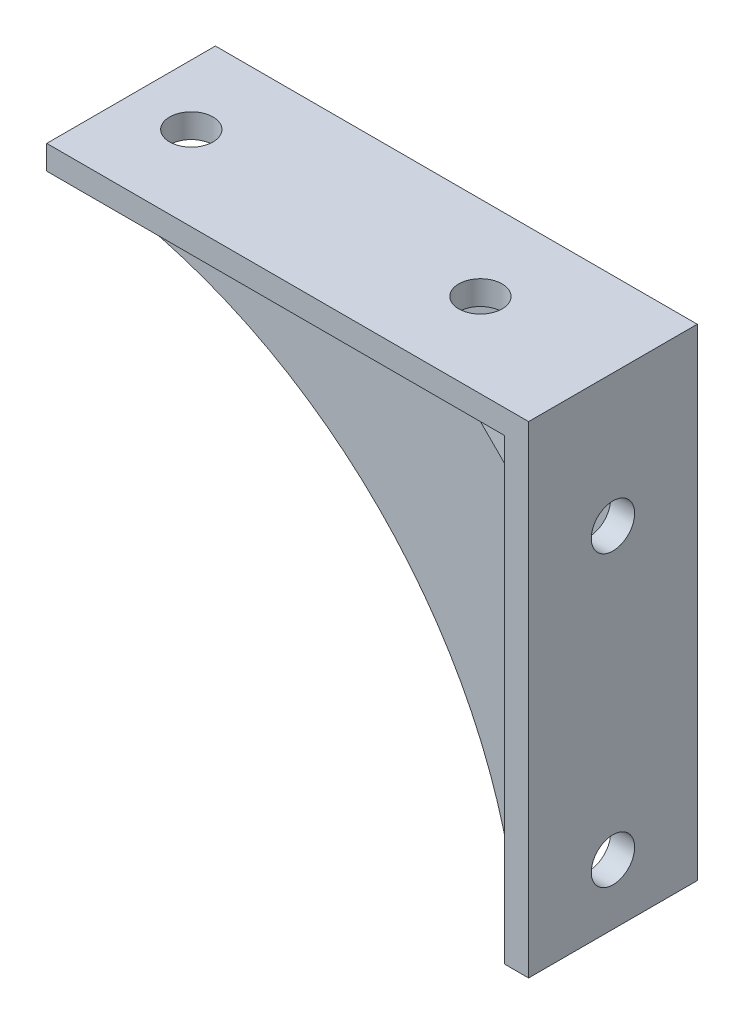
ISO-10303-21;
HEADER;
FILE_DESCRIPTION(('STEP AP214'),'2;1');
FILE_NAME('part.step','',(''),(''),'','','');
FILE_SCHEMA(('AUTOMOTIVE_DESIGN { 1 0 10303 214 1 1 1 1 }'));
ENDSEC;
DATA;
#1=APPLICATION_CONTEXT('core data for automotive mechanical design processes');
#2=APPLICATION_PROTOCOL_DEFINITION('international standard','automotive_design',2000,#1);
#3=PRODUCT_CONTEXT('',#1,'mechanical');
#4=PRODUCT('Part','Part','',(#3));
#5=PRODUCT_RELATED_PRODUCT_CATEGORY('part','',(#4));
#6=PRODUCT_DEFINITION_FORMATION('','',#4);
#7=PRODUCT_DEFINITION_CONTEXT('part definition',#1,'design');
#8=PRODUCT_DEFINITION('design','',#6,#7);
#9=PRODUCT_DEFINITION_SHAPE('','',#8);
#10=(LENGTH_UNIT() NAMED_UNIT(*) SI_UNIT(.MILLI.,.METRE.));
#11=(NAMED_UNIT(*) PLANE_ANGLE_UNIT() SI_UNIT($,.RADIAN.));
#12=(NAMED_UNIT(*) SI_UNIT($,.STERADIAN.) SOLID_ANGLE_UNIT());
#13=UNCERTAINTY_MEASURE_WITH_UNIT(LENGTH_MEASURE(1.E-05),#10,'distance_accuracy_value','');
#14=(GEOMETRIC_REPRESENTATION_CONTEXT(3) GLOBAL_UNCERTAINTY_ASSIGNED_CONTEXT((#13)) GLOBAL_UNIT_ASSIGNED_CONTEXT((#10,
#11,#12)) REPRESENTATION_CONTEXT('',''));
#15=CARTESIAN_POINT('',(0.,0.,0.));
#16=DIRECTION('',(0.,0.,1.));
#17=DIRECTION('',(1.,0.,0.));
#18=AXIS2_PLACEMENT_3D('',#15,#16,#17);
#19=CARTESIAN_POINT('',(-10.,0.,35.));
#20=DIRECTION('',(1.,0.,0.));
#21=DIRECTION('',(0.,1.,0.));
#22=AXIS2_PLACEMENT_3D('',#19,#20,#21);
#23=PLANE('',#22);
#24=CARTESIAN_POINT('',(-9.99999999999999,-55.,0.));
#25=DIRECTION('',(-1.,0.,0.));
#26=DIRECTION('',(0.,-1.,0.));
#27=AXIS2_PLACEMENT_3D('',#24,#25,#26);
#28=CIRCLE('',#27,9.);
#29=CARTESIAN_POINT('',(-9.99999999999999,-64.,0.));
#30=VERTEX_POINT('',#29);
#31=EDGE_CURVE('E161',#30,#30,#28,.T.);
#32=ORIENTED_EDGE('',*,*,#31,.F.);
#33=EDGE_LOOP('',(#32));
#34=FACE_BOUND('',#33,.T.);
#35=CARTESIAN_POINT('',(-9.99999999999998,-175.,0.));
#36=DIRECTION('',(-1.,0.,0.));
#37=DIRECTION('',(0.,-1.,0.));
#38=AXIS2_PLACEMENT_3D('',#35,#36,#37);
#39=CIRCLE('',#38,9.);
#40=CARTESIAN_POINT('',(-9.99999999999998,-184.,0.));
#41=VERTEX_POINT('',#40);
#42=EDGE_CURVE('E260',#41,#41,#39,.T.);
#43=ORIENTED_EDGE('',*,*,#42,.F.);
#44=EDGE_LOOP('',(#43));
#45=FACE_BOUND('',#44,.T.);
#46=DIRECTION('',(0.,0.,1.));
#47=VECTOR('',#46,1.);
#48=CARTESIAN_POINT('',(-10.,-185.,20.));
#49=LINE('',#48,#47);
#50=CARTESIAN_POINT('',(-9.99999999999998,-185.,20.));
#51=VERTEX_POINT('',#50);
#52=CARTESIAN_POINT('',(-9.99999999999998,-185.,30.));
#53=VERTEX_POINT('',#52);
#54=EDGE_CURVE('E56',#51,#53,#49,.T.);
#55=ORIENTED_EDGE('',*,*,#54,.F.);
#56=DIRECTION('',(0.,-1.,0.));
#57=VECTOR('',#56,1.);
#58=CARTESIAN_POINT('',(-10.,-30.,20.));
#59=LINE('',#58,#57);
#60=CARTESIAN_POINT('',(-10.,-30.,20.));
#61=VERTEX_POINT('',#60);
#62=EDGE_CURVE('E51',#61,#51,#59,.T.);
#63=ORIENTED_EDGE('',*,*,#62,.F.);
#64=DIRECTION('',(0.,0.,1.));
#65=VECTOR('',#64,1.);
#66=CARTESIAN_POINT('',(-10.,-30.,20.));
#67=LINE('',#66,#65);
#68=CARTESIAN_POINT('',(-10.,-30.,30.));
#69=VERTEX_POINT('',#68);
#70=EDGE_CURVE('E171',#61,#69,#67,.T.);
#71=ORIENTED_EDGE('',*,*,#70,.T.);
#72=DIRECTION('',(0.,-1.,0.));
#73=VECTOR('',#72,1.);
#74=CARTESIAN_POINT('',(-10.,-30.,30.));
#75=LINE('',#74,#73);
#76=EDGE_CURVE('E152',#69,#53,#75,.T.);
#77=ORIENTED_EDGE('',*,*,#76,.T.);
#78=EDGE_LOOP('',(#55,#63,#71,#77));
#79=FACE_BOUND('',#78,.T.);
#80=DIRECTION('',(0.,0.,-1.));
#81=VECTOR('',#80,1.);
#82=CARTESIAN_POINT('',(-10.,-30.,-20.));
#83=LINE('',#82,#81);
#84=CARTESIAN_POINT('',(-10.,-30.,-20.));
#85=VERTEX_POINT('',#84);
#86=CARTESIAN_POINT('',(-9.99999999999999,-30.,-30.));
#87=VERTEX_POINT('',#86);
#88=EDGE_CURVE('E202',#85,#87,#83,.T.);
#89=ORIENTED_EDGE('',*,*,#88,.F.);
#90=DIRECTION('',(0.,-1.,0.));
#91=VECTOR('',#90,1.);
#92=CARTESIAN_POINT('',(-10.,-30.,-20.));
#93=LINE('',#92,#91);
#94=CARTESIAN_POINT('',(-9.99999999999998,-185.,-20.));
#95=VERTEX_POINT('',#94);
#96=EDGE_CURVE('E180',#85,#95,#93,.T.);
#97=ORIENTED_EDGE('',*,*,#96,.T.);
#98=DIRECTION('',(0.,0.,-1.));
#99=VECTOR('',#98,1.);
#100=CARTESIAN_POINT('',(-10.,-185.,-20.));
#101=LINE('',#100,#99);
#102=CARTESIAN_POINT('',(-10.,-185.,-30.));
#103=VERTEX_POINT('',#102);
#104=EDGE_CURVE('E200',#95,#103,#101,.T.);
#105=ORIENTED_EDGE('',*,*,#104,.T.);
#106=DIRECTION('',(0.,-1.,0.));
#107=VECTOR('',#106,1.);
#108=CARTESIAN_POINT('',(-10.,-30.,-30.));
#109=LINE('',#108,#107);
#110=EDGE_CURVE('E191',#87,#103,#109,.T.);
#111=ORIENTED_EDGE('',*,*,#110,.F.);
#112=EDGE_LOOP('',(#89,#97,#105,#111));
#113=FACE_BOUND('',#112,.T.);
#114=DIRECTION('',(0.,-1.,0.));
#115=VECTOR('',#114,1.);
#116=CARTESIAN_POINT('',(-10.,0.,-35.));
#117=LINE('',#116,#115);
#118=CARTESIAN_POINT('',(-10.,-10.,-35.));
#119=VERTEX_POINT('',#118);
#120=CARTESIAN_POINT('',(-9.99999999999998,-200.,-35.));
#121=VERTEX_POINT('',#120);
#122=EDGE_CURVE('E199',#119,#121,#117,.T.);
#123=ORIENTED_EDGE('',*,*,#122,.T.);
#124=DIRECTION('',(0.,0.,-1.));
#125=VECTOR('',#124,1.);
#126=CARTESIAN_POINT('',(-9.99999999999998,-200.,35.));
#127=LINE('',#126,#125);
#128=CARTESIAN_POINT('',(-9.99999999999998,-200.,35.));
#129=VERTEX_POINT('',#128);
#130=EDGE_CURVE('E11',#129,#121,#127,.T.);
#131=ORIENTED_EDGE('',*,*,#130,.F.);
#132=DIRECTION('',(0.,-1.,0.));
#133=VECTOR('',#132,1.);
#134=CARTESIAN_POINT('',(-10.,0.,35.));
#135=LINE('',#134,#133);
#136=CARTESIAN_POINT('',(-10.,-10.,35.));
#137=VERTEX_POINT('',#136);
#138=EDGE_CURVE('E206',#137,#129,#135,.T.);
#139=ORIENTED_EDGE('',*,*,#138,.F.);
#140=DIRECTION('',(0.,0.,-1.));
#141=VECTOR('',#140,1.);
#142=CARTESIAN_POINT('',(-10.,-10.,35.));
#143=LINE('',#142,#141);
#144=EDGE_CURVE('E223',#137,#119,#143,.T.);
#145=ORIENTED_EDGE('',*,*,#144,.T.);
#146=EDGE_LOOP('',(#123,#131,#139,#145));
#147=FACE_BOUND('',#146,.T.);
#148=ADVANCED_FACE('F35',(#34,#45,#79,#113,#147),#23,.F.);
#149=CARTESIAN_POINT('',(0.,-200.,35.));
#150=DIRECTION('',(0.,-1.,0.));
#151=DIRECTION('',(0.,0.,-1.));
#152=AXIS2_PLACEMENT_3D('',#149,#150,#151);
#153=PLANE('',#152);
#154=DIRECTION('',(-1.,0.,0.));
#155=VECTOR('',#154,1.);
#156=CARTESIAN_POINT('',(0.,-200.,-35.));
#157=LINE('',#156,#155);
#158=CARTESIAN_POINT('',(0.,-200.,-35.));
#159=VERTEX_POINT('',#158);
#160=EDGE_CURVE('E226',#159,#121,#157,.T.);
#161=ORIENTED_EDGE('',*,*,#160,.F.);
#162=DIRECTION('',(0.,0.,-1.));
#163=VECTOR('',#162,1.);
#164=CARTESIAN_POINT('',(0.,-200.,35.));
#165=LINE('',#164,#163);
#166=CARTESIAN_POINT('',(0.,-200.,35.));
#167=VERTEX_POINT('',#166);
#168=EDGE_CURVE('E43',#167,#159,#165,.T.);
#169=ORIENTED_EDGE('',*,*,#168,.F.);
#170=DIRECTION('',(-1.,0.,0.));
#171=VECTOR('',#170,1.);
#172=CARTESIAN_POINT('',(0.,-200.,35.));
#173=LINE('',#172,#171);
#174=EDGE_CURVE('E208',#167,#129,#173,.T.);
#175=ORIENTED_EDGE('',*,*,#174,.T.);
#176=ORIENTED_EDGE('',*,*,#130,.T.);
#177=EDGE_LOOP('',(#161,#169,#175,#176));
#178=FACE_BOUND('',#177,.T.);
#179=ADVANCED_FACE('F279',(#178),#153,.T.);
#180=CARTESIAN_POINT('',(0.,0.,35.));
#181=DIRECTION('',(1.,0.,0.));
#182=DIRECTION('',(0.,1.,0.));
#183=AXIS2_PLACEMENT_3D('',#180,#181,#182);
#184=PLANE('',#183);
#185=CARTESIAN_POINT('',(0.,-55.,0.));
#186=DIRECTION('',(-1.,0.,0.));
#187=DIRECTION('',(0.,-1.,0.));
#188=AXIS2_PLACEMENT_3D('',#185,#186,#187);
#189=CIRCLE('',#188,9.);
#190=CARTESIAN_POINT('',(0.,-64.,0.));
#191=VERTEX_POINT('',#190);
#192=EDGE_CURVE('E158',#191,#191,#189,.T.);
#193=ORIENTED_EDGE('',*,*,#192,.T.);
#194=EDGE_LOOP('',(#193));
#195=FACE_BOUND('',#194,.T.);
#196=CARTESIAN_POINT('',(0.,-175.,0.));
#197=DIRECTION('',(-1.,0.,0.));
#198=DIRECTION('',(0.,-1.,0.));
#199=AXIS2_PLACEMENT_3D('',#196,#197,#198);
#200=CIRCLE('',#199,9.);
#201=CARTESIAN_POINT('',(0.,-184.,0.));
#202=VERTEX_POINT('',#201);
#203=EDGE_CURVE('E264',#202,#202,#200,.T.);
#204=ORIENTED_EDGE('',*,*,#203,.T.);
#205=EDGE_LOOP('',(#204));
#206=FACE_BOUND('',#205,.T.);
#207=DIRECTION('',(0.,-1.,0.));
#208=VECTOR('',#207,1.);
#209=CARTESIAN_POINT('',(0.,0.,-35.));
#210=LINE('',#209,#208);
#211=CARTESIAN_POINT('',(0.,0.,-35.));
#212=VERTEX_POINT('',#211);
#213=EDGE_CURVE('E229',#212,#159,#210,.T.);
#214=ORIENTED_EDGE('',*,*,#213,.F.);
#215=DIRECTION('',(0.,0.,-1.));
#216=VECTOR('',#215,1.);
#217=CARTESIAN_POINT('',(0.,0.,35.));
#218=LINE('',#217,#216);
#219=CARTESIAN_POINT('',(0.,0.,35.));
#220=VERTEX_POINT('',#219);
#221=EDGE_CURVE('E245',#220,#212,#218,.T.);
#222=ORIENTED_EDGE('',*,*,#221,.F.);
#223=DIRECTION('',(0.,-1.,0.));
#224=VECTOR('',#223,1.);
#225=CARTESIAN_POINT('',(0.,0.,35.));
#226=LINE('',#225,#224);
#227=EDGE_CURVE('E212',#220,#167,#226,.T.);
#228=ORIENTED_EDGE('',*,*,#227,.T.);
#229=ORIENTED_EDGE('',*,*,#168,.T.);
#230=EDGE_LOOP('',(#214,#222,#228,#229));
#231=FACE_BOUND('',#230,.T.);
#232=ADVANCED_FACE('F299',(#195,#206,#231),#184,.T.);
#233=CARTESIAN_POINT('',(-200.,0.,35.));
#234=DIRECTION('',(0.,1.,0.));
#235=DIRECTION('',(0.,0.,1.));
#236=AXIS2_PLACEMENT_3D('',#233,#234,#235);
#237=PLANE('',#236);
#238=CARTESIAN_POINT('',(-175.,0.,0.));
#239=DIRECTION('',(0.,1.,0.));
#240=DIRECTION('',(0.,0.,1.));
#241=AXIS2_PLACEMENT_3D('',#238,#239,#240);
#242=CIRCLE('',#241,9.);
#243=CARTESIAN_POINT('',(-175.,0.,9.));
#244=VERTEX_POINT('',#243);
#245=EDGE_CURVE('E257',#244,#244,#242,.T.);
#246=ORIENTED_EDGE('',*,*,#245,.F.);
#247=EDGE_LOOP('',(#246));
#248=FACE_BOUND('',#247,.T.);
#249=CARTESIAN_POINT('',(-55.,0.,0.));
#250=DIRECTION('',(0.,1.,0.));
#251=DIRECTION('',(0.,0.,1.));
#252=AXIS2_PLACEMENT_3D('',#249,#250,#251);
#253=CIRCLE('',#252,9.);
#254=CARTESIAN_POINT('',(-55.,0.,9.));
#255=VERTEX_POINT('',#254);
#256=EDGE_CURVE('E249',#255,#255,#253,.T.);
#257=ORIENTED_EDGE('',*,*,#256,.F.);
#258=EDGE_LOOP('',(#257));
#259=FACE_BOUND('',#258,.T.);
#260=DIRECTION('',(1.,0.,0.));
#261=VECTOR('',#260,1.);
#262=CARTESIAN_POINT('',(-200.,0.,-35.));
#263=LINE('',#262,#261);
#264=CARTESIAN_POINT('',(-200.,0.,-35.));
#265=VERTEX_POINT('',#264);
#266=EDGE_CURVE('E232',#265,#212,#263,.T.);
#267=ORIENTED_EDGE('',*,*,#266,.F.);
#268=DIRECTION('',(0.,0.,-1.));
#269=VECTOR('',#268,1.);
#270=CARTESIAN_POINT('',(-200.,0.,35.));
#271=LINE('',#270,#269);
#272=CARTESIAN_POINT('',(-200.,0.,35.));
#273=VERTEX_POINT('',#272);
#274=EDGE_CURVE('E243',#273,#265,#271,.T.);
#275=ORIENTED_EDGE('',*,*,#274,.F.);
#276=DIRECTION('',(1.,0.,0.));
#277=VECTOR('',#276,1.);
#278=CARTESIAN_POINT('',(-200.,0.,35.));
#279=LINE('',#278,#277);
#280=EDGE_CURVE('E215',#273,#220,#279,.T.);
#281=ORIENTED_EDGE('',*,*,#280,.T.);
#282=ORIENTED_EDGE('',*,*,#221,.T.);
#283=EDGE_LOOP('',(#267,#275,#281,#282));
#284=FACE_BOUND('',#283,.T.);
#285=ADVANCED_FACE('F302',(#248,#259,#284),#237,.T.);
#286=CARTESIAN_POINT('',(-200.,-10.,35.));
#287=DIRECTION('',(-1.,0.,0.));
#288=DIRECTION('',(0.,0.,1.));
#289=AXIS2_PLACEMENT_3D('',#286,#287,#288);
#290=PLANE('',#289);
#291=DIRECTION('',(0.,1.,0.));
#292=VECTOR('',#291,1.);
#293=CARTESIAN_POINT('',(-200.,-10.,-35.));
#294=LINE('',#293,#292);
#295=CARTESIAN_POINT('',(-200.,-10.,-35.));
#296=VERTEX_POINT('',#295);
#297=EDGE_CURVE('E235',#296,#265,#294,.T.);
#298=ORIENTED_EDGE('',*,*,#297,.F.);
#299=DIRECTION('',(0.,0.,-1.));
#300=VECTOR('',#299,1.);
#301=CARTESIAN_POINT('',(-200.,-10.,35.));
#302=LINE('',#301,#300);
#303=CARTESIAN_POINT('',(-200.,-10.,35.));
#304=VERTEX_POINT('',#303);
#305=EDGE_CURVE('E241',#304,#296,#302,.T.);
#306=ORIENTED_EDGE('',*,*,#305,.F.);
#307=DIRECTION('',(0.,1.,0.));
#308=VECTOR('',#307,1.);
#309=CARTESIAN_POINT('',(-200.,-10.,35.));
#310=LINE('',#309,#308);
#311=EDGE_CURVE('E218',#304,#273,#310,.T.);
#312=ORIENTED_EDGE('',*,*,#311,.T.);
#313=ORIENTED_EDGE('',*,*,#274,.T.);
#314=EDGE_LOOP('',(#298,#306,#312,#313));
#315=FACE_BOUND('',#314,.T.);
#316=ADVANCED_FACE('F306',(#315),#290,.T.);
#317=CARTESIAN_POINT('',(-200.,-10.,35.));
#318=DIRECTION('',(0.,1.,0.));
#319=DIRECTION('',(0.,0.,1.));
#320=AXIS2_PLACEMENT_3D('',#317,#318,#319);
#321=PLANE('',#320);
#322=CARTESIAN_POINT('',(-175.,-10.,0.));
#323=DIRECTION('',(0.,1.,0.));
#324=DIRECTION('',(0.,0.,1.));
#325=AXIS2_PLACEMENT_3D('',#322,#323,#324);
#326=CIRCLE('',#325,9.);
#327=CARTESIAN_POINT('',(-175.,-10.,9.));
#328=VERTEX_POINT('',#327);
#329=EDGE_CURVE('E38',#328,#328,#326,.T.);
#330=ORIENTED_EDGE('',*,*,#329,.T.);
#331=EDGE_LOOP('',(#330));
#332=FACE_BOUND('',#331,.T.);
#333=CARTESIAN_POINT('',(-55.0000000000001,-10.,0.));
#334=DIRECTION('',(0.,1.,0.));
#335=DIRECTION('',(0.,0.,1.));
#336=AXIS2_PLACEMENT_3D('',#333,#334,#335);
#337=CIRCLE('',#336,9.);
#338=CARTESIAN_POINT('',(-55.0000000000001,-10.,9.));
#339=VERTEX_POINT('',#338);
#340=EDGE_CURVE('E247',#339,#339,#337,.T.);
#341=ORIENTED_EDGE('',*,*,#340,.T.);
#342=EDGE_LOOP('',(#341));
#343=FACE_BOUND('',#342,.T.);
#344=DIRECTION('',(0.,0.,1.));
#345=VECTOR('',#344,1.);
#346=CARTESIAN_POINT('',(-30.,-10.,20.));
#347=LINE('',#346,#345);
#348=CARTESIAN_POINT('',(-30.,-10.,20.));
#349=VERTEX_POINT('',#348);
#350=CARTESIAN_POINT('',(-30.,-10.,30.));
#351=VERTEX_POINT('',#350);
#352=EDGE_CURVE('E168',#349,#351,#347,.T.);
#353=ORIENTED_EDGE('',*,*,#352,.F.);
#354=DIRECTION('',(1.,0.,0.));
#355=VECTOR('',#354,1.);
#356=CARTESIAN_POINT('',(-185.,-10.,20.));
#357=LINE('',#356,#355);
#358=CARTESIAN_POINT('',(-185.,-10.,20.));
#359=VERTEX_POINT('',#358);
#360=EDGE_CURVE('E141',#359,#349,#357,.T.);
#361=ORIENTED_EDGE('',*,*,#360,.F.);
#362=DIRECTION('',(0.,0.,1.));
#363=VECTOR('',#362,1.);
#364=CARTESIAN_POINT('',(-185.,-10.,20.));
#365=LINE('',#364,#363);
#366=CARTESIAN_POINT('',(-185.,-10.,30.));
#367=VERTEX_POINT('',#366);
#368=EDGE_CURVE('E133',#359,#367,#365,.T.);
#369=ORIENTED_EDGE('',*,*,#368,.T.);
#370=DIRECTION('',(1.,0.,0.));
#371=VECTOR('',#370,1.);
#372=CARTESIAN_POINT('',(-185.,-10.,30.));
#373=LINE('',#372,#371);
#374=EDGE_CURVE('E138',#367,#351,#373,.T.);
#375=ORIENTED_EDGE('',*,*,#374,.T.);
#376=EDGE_LOOP('',(#353,#361,#369,#375));
#377=FACE_BOUND('',#376,.T.);
#378=DIRECTION('',(0.,0.,-1.));
#379=VECTOR('',#378,1.);
#380=CARTESIAN_POINT('',(-185.,-10.,-20.));
#381=LINE('',#380,#379);
#382=CARTESIAN_POINT('',(-185.,-10.,-20.));
#383=VERTEX_POINT('',#382);
#384=CARTESIAN_POINT('',(-185.,-10.,-30.));
#385=VERTEX_POINT('',#384);
#386=EDGE_CURVE('E196',#383,#385,#381,.T.);
#387=ORIENTED_EDGE('',*,*,#386,.F.);
#388=DIRECTION('',(1.,0.,0.));
#389=VECTOR('',#388,1.);
#390=CARTESIAN_POINT('',(-185.,-10.,-20.));
#391=LINE('',#390,#389);
#392=CARTESIAN_POINT('',(-30.,-10.,-20.));
#393=VERTEX_POINT('',#392);
#394=EDGE_CURVE('E174',#383,#393,#391,.T.);
#395=ORIENTED_EDGE('',*,*,#394,.T.);
#396=DIRECTION('',(0.,0.,-1.));
#397=VECTOR('',#396,1.);
#398=CARTESIAN_POINT('',(-30.,-10.,-20.));
#399=LINE('',#398,#397);
#400=CARTESIAN_POINT('',(-30.,-10.,-30.));
#401=VERTEX_POINT('',#400);
#402=EDGE_CURVE('E185',#393,#401,#399,.T.);
#403=ORIENTED_EDGE('',*,*,#402,.T.);
#404=DIRECTION('',(1.,0.,0.));
#405=VECTOR('',#404,1.);
#406=CARTESIAN_POINT('',(-185.,-10.,-30.));
#407=LINE('',#406,#405);
#408=EDGE_CURVE('E170',#385,#401,#407,.T.);
#409=ORIENTED_EDGE('',*,*,#408,.F.);
#410=EDGE_LOOP('',(#387,#395,#403,#409));
#411=FACE_BOUND('',#410,.T.);
#412=DIRECTION('',(1.,0.,0.));
#413=VECTOR('',#412,1.);
#414=CARTESIAN_POINT('',(-200.,-10.,-35.));
#415=LINE('',#414,#413);
#416=EDGE_CURVE('E209',#296,#119,#415,.T.);
#417=ORIENTED_EDGE('',*,*,#416,.T.);
#418=ORIENTED_EDGE('',*,*,#144,.F.);
#419=DIRECTION('',(1.,0.,0.));
#420=VECTOR('',#419,1.);
#421=CARTESIAN_POINT('',(-200.,-10.,35.));
#422=LINE('',#421,#420);
#423=EDGE_CURVE('E221',#304,#137,#422,.T.);
#424=ORIENTED_EDGE('',*,*,#423,.F.);
#425=ORIENTED_EDGE('',*,*,#305,.T.);
#426=EDGE_LOOP('',(#417,#418,#424,#425));
#427=FACE_BOUND('',#426,.T.);
#428=ADVANCED_FACE('F135',(#332,#343,#377,#411,#427),#321,.F.);
#429=CARTESIAN_POINT('',(0.,0.,35.));
#430=DIRECTION('',(0.,0.,-1.));
#431=DIRECTION('',(-1.,0.,0.));
#432=AXIS2_PLACEMENT_3D('',#429,#430,#431);
#433=PLANE('',#432);
#434=ORIENTED_EDGE('',*,*,#138,.T.);
#435=ORIENTED_EDGE('',*,*,#174,.F.);
#436=ORIENTED_EDGE('',*,*,#227,.F.);
#437=ORIENTED_EDGE('',*,*,#280,.F.);
#438=ORIENTED_EDGE('',*,*,#311,.F.);
#439=ORIENTED_EDGE('',*,*,#423,.T.);
#440=EDGE_LOOP('',(#434,#435,#436,#437,#438,#439));
#441=FACE_BOUND('',#440,.T.);
#442=ADVANCED_FACE('F296',(#441),#433,.F.);
#443=CARTESIAN_POINT('',(0.,0.,-35.));
#444=DIRECTION('',(0.,0.,-1.));
#445=DIRECTION('',(-1.,0.,0.));
#446=AXIS2_PLACEMENT_3D('',#443,#444,#445);
#447=PLANE('',#446);
#448=ORIENTED_EDGE('',*,*,#122,.F.);
#449=ORIENTED_EDGE('',*,*,#416,.F.);
#450=ORIENTED_EDGE('',*,*,#297,.T.);
#451=ORIENTED_EDGE('',*,*,#266,.T.);
#452=ORIENTED_EDGE('',*,*,#213,.T.);
#453=ORIENTED_EDGE('',*,*,#160,.T.);
#454=EDGE_LOOP('',(#448,#449,#450,#451,#452,#453));
#455=FACE_BOUND('',#454,.T.);
#456=ADVANCED_FACE('F290',(#455),#447,.T.);
#457=CARTESIAN_POINT('',(-208.602430216445,-208.602430216445,-20.));
#458=DIRECTION('',(0.,0.,-1.));
#459=DIRECTION('',(-1.,0.,0.));
#460=AXIS2_PLACEMENT_3D('',#457,#458,#459);
#461=CYLINDRICAL_SURFACE('',#460,200.);
#462=CARTESIAN_POINT('',(-208.602430216445,-208.602430216445,-30.));
#463=DIRECTION('',(0.,0.,1.));
#464=DIRECTION('',(1.,0.,0.));
#465=AXIS2_PLACEMENT_3D('',#462,#463,#464);
#466=CIRCLE('',#465,200.);
#467=EDGE_CURVE('E177',#103,#385,#466,.T.);
#468=ORIENTED_EDGE('',*,*,#467,.F.);
#469=ORIENTED_EDGE('',*,*,#104,.F.);
#470=CARTESIAN_POINT('',(-208.602430216445,-208.602430216445,-20.));
#471=DIRECTION('',(0.,0.,1.));
#472=DIRECTION('',(1.,0.,0.));
#473=AXIS2_PLACEMENT_3D('',#470,#471,#472);
#474=CIRCLE('',#473,200.);
#475=EDGE_CURVE('E182',#95,#383,#474,.T.);
#476=ORIENTED_EDGE('',*,*,#475,.T.);
#477=ORIENTED_EDGE('',*,*,#386,.T.);
#478=EDGE_LOOP('',(#468,#469,#476,#477));
#479=FACE_BOUND('',#478,.T.);
#480=ADVANCED_FACE('F360',(#479),#461,.F.);
#481=CARTESIAN_POINT('',(-30.,-10.,-20.));
#482=DIRECTION('',(0.707106781186548,0.707106781186547,0.));
#483=DIRECTION('',(-0.707106781186547,0.707106781186548,0.));
#484=AXIS2_PLACEMENT_3D('',#481,#482,#483);
#485=PLANE('',#484);
#486=DIRECTION('',(0.707106781186547,-0.707106781186548,0.));
#487=VECTOR('',#486,1.);
#488=CARTESIAN_POINT('',(-30.,-10.,-30.));
#489=LINE('',#488,#487);
#490=EDGE_CURVE('E188',#401,#87,#489,.T.);
#491=ORIENTED_EDGE('',*,*,#490,.F.);
#492=ORIENTED_EDGE('',*,*,#402,.F.);
#493=DIRECTION('',(0.707106781186547,-0.707106781186548,0.));
#494=VECTOR('',#493,1.);
#495=CARTESIAN_POINT('',(-30.,-10.,-20.));
#496=LINE('',#495,#494);
#497=EDGE_CURVE('E176',#393,#85,#496,.T.);
#498=ORIENTED_EDGE('',*,*,#497,.T.);
#499=ORIENTED_EDGE('',*,*,#88,.T.);
#500=EDGE_LOOP('',(#491,#492,#498,#499));
#501=FACE_BOUND('',#500,.T.);
#502=ADVANCED_FACE('F368',(#501),#485,.T.);
#503=CARTESIAN_POINT('',(-208.602430216445,-208.602430216445,-20.));
#504=DIRECTION('',(0.,0.,1.));
#505=DIRECTION('',(1.,0.,0.));
#506=AXIS2_PLACEMENT_3D('',#503,#504,#505);
#507=PLANE('',#506);
#508=ORIENTED_EDGE('',*,*,#394,.F.);
#509=ORIENTED_EDGE('',*,*,#475,.F.);
#510=ORIENTED_EDGE('',*,*,#96,.F.);
#511=ORIENTED_EDGE('',*,*,#497,.F.);
#512=EDGE_LOOP('',(#508,#509,#510,#511));
#513=FACE_BOUND('',#512,.T.);
#514=ADVANCED_FACE('F378',(#513),#507,.T.);
#515=CARTESIAN_POINT('',(-208.602430216445,-208.602430216445,-30.));
#516=DIRECTION('',(0.,0.,1.));
#517=DIRECTION('',(1.,0.,0.));
#518=AXIS2_PLACEMENT_3D('',#515,#516,#517);
#519=PLANE('',#518);
#520=ORIENTED_EDGE('',*,*,#408,.T.);
#521=ORIENTED_EDGE('',*,*,#490,.T.);
#522=ORIENTED_EDGE('',*,*,#110,.T.);
#523=ORIENTED_EDGE('',*,*,#467,.T.);
#524=EDGE_LOOP('',(#520,#521,#522,#523));
#525=FACE_BOUND('',#524,.T.);
#526=ADVANCED_FACE('F388',(#525),#519,.F.);
#527=CARTESIAN_POINT('',(-30.,-10.,20.));
#528=DIRECTION('',(-0.707106781186548,-0.707106781186547,0.));
#529=DIRECTION('',(0.707106781186547,-0.707106781186548,0.));
#530=AXIS2_PLACEMENT_3D('',#527,#528,#529);
#531=PLANE('',#530);
#532=DIRECTION('',(0.707106781186547,-0.707106781186548,0.));
#533=VECTOR('',#532,1.);
#534=CARTESIAN_POINT('',(-30.,-10.,30.));
#535=LINE('',#534,#533);
#536=EDGE_CURVE('E156',#351,#69,#535,.T.);
#537=ORIENTED_EDGE('',*,*,#536,.T.);
#538=ORIENTED_EDGE('',*,*,#70,.F.);
#539=DIRECTION('',(0.707106781186547,-0.707106781186548,0.));
#540=VECTOR('',#539,1.);
#541=CARTESIAN_POINT('',(-30.,-10.,20.));
#542=LINE('',#541,#540);
#543=EDGE_CURVE('E145',#349,#61,#542,.T.);
#544=ORIENTED_EDGE('',*,*,#543,.F.);
#545=ORIENTED_EDGE('',*,*,#352,.T.);
#546=EDGE_LOOP('',(#537,#538,#544,#545));
#547=FACE_BOUND('',#546,.T.);
#548=ADVANCED_FACE('F276',(#547),#531,.F.);
#549=CARTESIAN_POINT('',(-208.602430216445,-208.602430216445,20.));
#550=DIRECTION('',(0.,0.,1.));
#551=DIRECTION('',(1.,0.,0.));
#552=AXIS2_PLACEMENT_3D('',#549,#550,#551);
#553=CYLINDRICAL_SURFACE('',#552,200.);
#554=CARTESIAN_POINT('',(-208.602430216445,-208.602430216445,30.));
#555=DIRECTION('',(0.,0.,1.));
#556=DIRECTION('',(1.,0.,0.));
#557=AXIS2_PLACEMENT_3D('',#554,#555,#556);
#558=CIRCLE('',#557,200.);
#559=EDGE_CURVE('E148',#53,#367,#558,.T.);
#560=ORIENTED_EDGE('',*,*,#559,.T.);
#561=ORIENTED_EDGE('',*,*,#368,.F.);
#562=CARTESIAN_POINT('',(-208.602430216445,-208.602430216445,20.));
#563=DIRECTION('',(0.,0.,1.));
#564=DIRECTION('',(1.,0.,0.));
#565=AXIS2_PLACEMENT_3D('',#562,#563,#564);
#566=CIRCLE('',#565,200.);
#567=EDGE_CURVE('E270',#51,#359,#566,.T.);
#568=ORIENTED_EDGE('',*,*,#567,.F.);
#569=ORIENTED_EDGE('',*,*,#54,.T.);
#570=EDGE_LOOP('',(#560,#561,#568,#569));
#571=FACE_BOUND('',#570,.T.);
#572=ADVANCED_FACE('F149',(#571),#553,.F.);
#573=CARTESIAN_POINT('',(-208.602430216445,-208.602430216445,20.));
#574=DIRECTION('',(0.,0.,-1.));
#575=DIRECTION('',(1.,0.,0.));
#576=AXIS2_PLACEMENT_3D('',#573,#574,#575);
#577=PLANE('',#576);
#578=ORIENTED_EDGE('',*,*,#360,.T.);
#579=ORIENTED_EDGE('',*,*,#543,.T.);
#580=ORIENTED_EDGE('',*,*,#62,.T.);
#581=ORIENTED_EDGE('',*,*,#567,.T.);
#582=EDGE_LOOP('',(#578,#579,#580,#581));
#583=FACE_BOUND('',#582,.T.);
#584=ADVANCED_FACE('F274',(#583),#577,.T.);
#585=CARTESIAN_POINT('',(-208.602430216445,-208.602430216445,30.));
#586=DIRECTION('',(0.,0.,-1.));
#587=DIRECTION('',(1.,0.,0.));
#588=AXIS2_PLACEMENT_3D('',#585,#586,#587);
#589=PLANE('',#588);
#590=ORIENTED_EDGE('',*,*,#374,.F.);
#591=ORIENTED_EDGE('',*,*,#559,.F.);
#592=ORIENTED_EDGE('',*,*,#76,.F.);
#593=ORIENTED_EDGE('',*,*,#536,.F.);
#594=EDGE_LOOP('',(#590,#591,#592,#593));
#595=FACE_BOUND('',#594,.T.);
#596=ADVANCED_FACE('F154',(#595),#589,.F.);
#597=CARTESIAN_POINT('',(0.,-175.,0.));
#598=DIRECTION('',(-1.,0.,0.));
#599=DIRECTION('',(0.,-1.,0.));
#600=AXIS2_PLACEMENT_3D('',#597,#598,#599);
#601=CYLINDRICAL_SURFACE('',#600,9.);
#602=ORIENTED_EDGE('',*,*,#203,.F.);
#603=EDGE_LOOP('',(#602));
#604=FACE_BOUND('',#603,.T.);
#605=ORIENTED_EDGE('',*,*,#42,.T.);
#606=EDGE_LOOP('',(#605));
#607=FACE_BOUND('',#606,.T.);
#608=ADVANCED_FACE('F430',(#604,#607),#601,.F.);
#609=CARTESIAN_POINT('',(0.,-55.,0.));
#610=DIRECTION('',(-1.,0.,0.));
#611=DIRECTION('',(0.,-1.,0.));
#612=AXIS2_PLACEMENT_3D('',#609,#610,#611);
#613=CYLINDRICAL_SURFACE('',#612,9.);
#614=ORIENTED_EDGE('',*,*,#192,.F.);
#615=EDGE_LOOP('',(#614));
#616=FACE_BOUND('',#615,.T.);
#617=ORIENTED_EDGE('',*,*,#31,.T.);
#618=EDGE_LOOP('',(#617));
#619=FACE_BOUND('',#618,.T.);
#620=ADVANCED_FACE('F449',(#616,#619),#613,.F.);
#621=CARTESIAN_POINT('',(-55.0000000000007,-200.000000000001,0.));
#622=DIRECTION('',(0.,1.,0.));
#623=DIRECTION('',(-1.,0.,0.));
#624=AXIS2_PLACEMENT_3D('',#621,#622,#623);
#625=CYLINDRICAL_SURFACE('',#624,9.);
#626=ORIENTED_EDGE('',*,*,#256,.T.);
#627=EDGE_LOOP('',(#626));
#628=FACE_BOUND('',#627,.T.);
#629=ORIENTED_EDGE('',*,*,#340,.F.);
#630=EDGE_LOOP('',(#629));
#631=FACE_BOUND('',#630,.T.);
#632=ADVANCED_FACE('F455',(#628,#631),#625,.F.);
#633=CARTESIAN_POINT('',(-175.000000000001,-200.,0.));
#634=DIRECTION('',(0.,1.,0.));
#635=DIRECTION('',(-1.,0.,0.));
#636=AXIS2_PLACEMENT_3D('',#633,#634,#635);
#637=CYLINDRICAL_SURFACE('',#636,9.);
#638=ORIENTED_EDGE('',*,*,#245,.T.);
#639=EDGE_LOOP('',(#638));
#640=FACE_BOUND('',#639,.T.);
#641=ORIENTED_EDGE('',*,*,#329,.F.);
#642=EDGE_LOOP('',(#641));
#643=FACE_BOUND('',#642,.T.);
#644=ADVANCED_FACE('F463',(#640,#643),#637,.F.);
#645=CLOSED_SHELL('',(#148,#179,#232,#285,#316,#428,#442,#456,#480,#502,#514,#526,#548,#572,
#584,#596,#608,#620,#632,#644));
#646=MANIFOLD_SOLID_BREP('B2',#645);
#647=ADVANCED_BREP_SHAPE_REPRESENTATION('',(#18,#646),#14);
#648=SHAPE_DEFINITION_REPRESENTATION(#9,#647);
ENDSEC;
END-ISO-10303-21;
